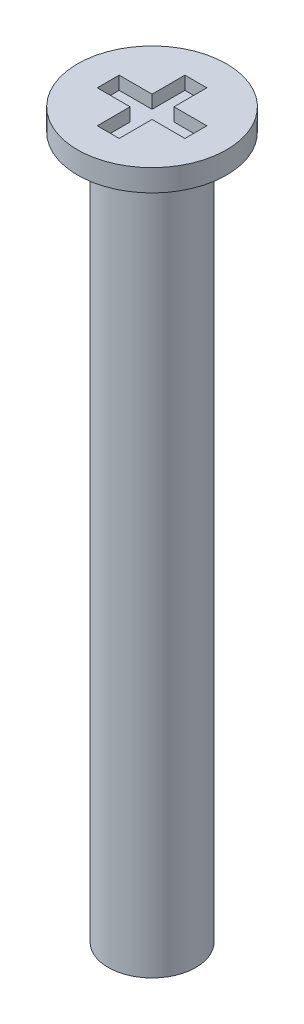
ISO-10303-21;
HEADER;
FILE_DESCRIPTION(('STEP AP214'),'2;1');
FILE_NAME('part.step','',(''),(''),'','','');
FILE_SCHEMA(('AUTOMOTIVE_DESIGN { 1 0 10303 214 1 1 1 1 }'));
ENDSEC;
DATA;
#1=APPLICATION_CONTEXT('core data for automotive mechanical design processes');
#2=APPLICATION_PROTOCOL_DEFINITION('international standard','automotive_design',2000,#1);
#3=PRODUCT_CONTEXT('',#1,'mechanical');
#4=PRODUCT('Part','Part','',(#3));
#5=PRODUCT_RELATED_PRODUCT_CATEGORY('part','',(#4));
#6=PRODUCT_DEFINITION_FORMATION('','',#4);
#7=PRODUCT_DEFINITION_CONTEXT('part definition',#1,'design');
#8=PRODUCT_DEFINITION('design','',#6,#7);
#9=PRODUCT_DEFINITION_SHAPE('','',#8);
#10=(LENGTH_UNIT() NAMED_UNIT(*) SI_UNIT(.MILLI.,.METRE.));
#11=(NAMED_UNIT(*) PLANE_ANGLE_UNIT() SI_UNIT($,.RADIAN.));
#12=(NAMED_UNIT(*) SI_UNIT($,.STERADIAN.) SOLID_ANGLE_UNIT());
#13=UNCERTAINTY_MEASURE_WITH_UNIT(LENGTH_MEASURE(1.E-05),#10,'distance_accuracy_value','');
#14=(GEOMETRIC_REPRESENTATION_CONTEXT(3) GLOBAL_UNCERTAINTY_ASSIGNED_CONTEXT((#13)) GLOBAL_UNIT_ASSIGNED_CONTEXT((#10,
#11,#12)) REPRESENTATION_CONTEXT('',''));
#15=CARTESIAN_POINT('',(0.,0.,0.));
#16=DIRECTION('',(0.,0.,1.));
#17=DIRECTION('',(1.,0.,0.));
#18=AXIS2_PLACEMENT_3D('',#15,#16,#17);
#19=CARTESIAN_POINT('',(0.,0.,0.));
#20=DIRECTION('',(0.,1.,0.));
#21=DIRECTION('',(0.,0.,1.));
#22=AXIS2_PLACEMENT_3D('',#19,#20,#21);
#23=PLANE('',#22);
#24=DIRECTION('',(-1.,0.,0.));
#25=VECTOR('',#24,1.);
#26=CARTESIAN_POINT('',(0.,0.,-0.25));
#27=LINE('',#26,#25);
#28=CARTESIAN_POINT('',(1.,0.,-0.249999999999997));
#29=VERTEX_POINT('',#28);
#30=CARTESIAN_POINT('',(0.25,0.,-0.249999999999999));
#31=VERTEX_POINT('',#30);
#32=EDGE_CURVE('E216',#29,#31,#27,.T.);
#33=ORIENTED_EDGE('',*,*,#32,.F.);
#34=DIRECTION('',(0.,0.,-1.));
#35=VECTOR('',#34,1.);
#36=CARTESIAN_POINT('',(1.,0.,-0.249999999999997));
#37=LINE('',#36,#35);
#38=CARTESIAN_POINT('',(0.999999999999999,0.,0.250000000000003));
#39=VERTEX_POINT('',#38);
#40=EDGE_CURVE('E143',#39,#29,#37,.T.);
#41=ORIENTED_EDGE('',*,*,#40,.F.);
#42=DIRECTION('',(1.,0.,0.));
#43=VECTOR('',#42,1.);
#44=CARTESIAN_POINT('',(0.,0.,0.25));
#45=LINE('',#44,#43);
#46=CARTESIAN_POINT('',(0.25,0.,0.250000000000003));
#47=VERTEX_POINT('',#46);
#48=EDGE_CURVE('E219',#47,#39,#45,.T.);
#49=ORIENTED_EDGE('',*,*,#48,.F.);
#50=DIRECTION('',(0.,0.,-1.));
#51=VECTOR('',#50,1.);
#52=CARTESIAN_POINT('',(0.25,0.,0.));
#53=LINE('',#52,#51);
#54=CARTESIAN_POINT('',(0.25,0.,1.));
#55=VERTEX_POINT('',#54);
#56=EDGE_CURVE('E176',#55,#47,#53,.T.);
#57=ORIENTED_EDGE('',*,*,#56,.F.);
#58=DIRECTION('',(1.,0.,0.));
#59=VECTOR('',#58,1.);
#60=CARTESIAN_POINT('',(0.25,0.,1.));
#61=LINE('',#60,#59);
#62=CARTESIAN_POINT('',(-0.25,0.,1.));
#63=VERTEX_POINT('',#62);
#64=EDGE_CURVE('E181',#63,#55,#61,.T.);
#65=ORIENTED_EDGE('',*,*,#64,.F.);
#66=DIRECTION('',(0.,0.,1.));
#67=VECTOR('',#66,1.);
#68=CARTESIAN_POINT('',(-0.25,0.,0.));
#69=LINE('',#68,#67);
#70=CARTESIAN_POINT('',(-0.25,0.,0.249999999999998));
#71=VERTEX_POINT('',#70);
#72=EDGE_CURVE('E192',#71,#63,#69,.T.);
#73=ORIENTED_EDGE('',*,*,#72,.F.);
#74=DIRECTION('',(1.,0.,0.));
#75=VECTOR('',#74,1.);
#76=CARTESIAN_POINT('',(0.,0.,0.25));
#77=LINE('',#76,#75);
#78=CARTESIAN_POINT('',(-1.,0.,0.24999999999999));
#79=VERTEX_POINT('',#78);
#80=EDGE_CURVE('E165',#79,#71,#77,.T.);
#81=ORIENTED_EDGE('',*,*,#80,.F.);
#82=DIRECTION('',(0.,0.,1.));
#83=VECTOR('',#82,1.);
#84=CARTESIAN_POINT('',(-1.,0.,0.24999999999999));
#85=LINE('',#84,#83);
#86=CARTESIAN_POINT('',(-0.999999999999997,0.,-0.25000000000001));
#87=VERTEX_POINT('',#86);
#88=EDGE_CURVE('E162',#87,#79,#85,.T.);
#89=ORIENTED_EDGE('',*,*,#88,.F.);
#90=CARTESIAN_POINT('',(-0.25,0.,-0.250000000000001));
#91=VERTEX_POINT('',#90);
#92=EDGE_CURVE('E149',#91,#87,#27,.T.);
#93=ORIENTED_EDGE('',*,*,#92,.F.);
#94=DIRECTION('',(0.,0.,1.));
#95=VECTOR('',#94,1.);
#96=CARTESIAN_POINT('',(-0.25,0.,0.));
#97=LINE('',#96,#95);
#98=CARTESIAN_POINT('',(-0.25,0.,-1.));
#99=VERTEX_POINT('',#98);
#100=EDGE_CURVE('E237',#99,#91,#97,.T.);
#101=ORIENTED_EDGE('',*,*,#100,.F.);
#102=DIRECTION('',(-1.,0.,0.));
#103=VECTOR('',#102,1.);
#104=CARTESIAN_POINT('',(-0.25,0.,-1.));
#105=LINE('',#104,#103);
#106=CARTESIAN_POINT('',(0.25,0.,-1.));
#107=VERTEX_POINT('',#106);
#108=EDGE_CURVE('E241',#107,#99,#105,.T.);
#109=ORIENTED_EDGE('',*,*,#108,.F.);
#110=DIRECTION('',(0.,0.,-1.));
#111=VECTOR('',#110,1.);
#112=CARTESIAN_POINT('',(0.25,0.,0.));
#113=LINE('',#112,#111);
#114=EDGE_CURVE('E68',#31,#107,#113,.T.);
#115=ORIENTED_EDGE('',*,*,#114,.F.);
#116=EDGE_LOOP('',(#33,#41,#49,#57,#65,#73,#81,#89,#93,#101,#109,#115));
#117=FACE_BOUND('',#116,.T.);
#118=CARTESIAN_POINT('',(0.,0.,0.));
#119=DIRECTION('',(0.,-1.,0.));
#120=DIRECTION('',(0.,0.,-1.));
#121=AXIS2_PLACEMENT_3D('',#118,#119,#120);
#122=CIRCLE('',#121,1.7);
#123=CARTESIAN_POINT('',(0.,0.,-1.7));
#124=VERTEX_POINT('',#123);
#125=EDGE_CURVE('E11',#124,#124,#122,.T.);
#126=ORIENTED_EDGE('',*,*,#125,.F.);
#127=EDGE_LOOP('',(#126));
#128=FACE_BOUND('',#127,.T.);
#129=ADVANCED_FACE('F39',(#117,#128),#23,.T.);
#130=CARTESIAN_POINT('',(0.,-16.5,0.));
#131=DIRECTION('',(0.,-1.,0.));
#132=DIRECTION('',(0.,0.,-1.));
#133=AXIS2_PLACEMENT_3D('',#130,#131,#132);
#134=CYLINDRICAL_SURFACE('',#133,1.7);
#135=ORIENTED_EDGE('',*,*,#125,.T.);
#136=EDGE_LOOP('',(#135));
#137=FACE_BOUND('',#136,.T.);
#138=CARTESIAN_POINT('',(0.,-0.5,0.));
#139=DIRECTION('',(0.,-1.,0.));
#140=DIRECTION('',(0.,0.,-1.));
#141=AXIS2_PLACEMENT_3D('',#138,#139,#140);
#142=CIRCLE('',#141,1.7);
#143=CARTESIAN_POINT('',(0.,-0.5,-1.7));
#144=VERTEX_POINT('',#143);
#145=EDGE_CURVE('E48',#144,#144,#142,.T.);
#146=ORIENTED_EDGE('',*,*,#145,.F.);
#147=EDGE_LOOP('',(#146));
#148=FACE_BOUND('',#147,.T.);
#149=ADVANCED_FACE('F273',(#137,#148),#134,.T.);
#150=CARTESIAN_POINT('',(1.7,-0.5,0.));
#151=DIRECTION('',(0.,-1.,0.));
#152=DIRECTION('',(0.,0.,-1.));
#153=AXIS2_PLACEMENT_3D('',#150,#151,#152);
#154=PLANE('',#153);
#155=ORIENTED_EDGE('',*,*,#145,.T.);
#156=EDGE_LOOP('',(#155));
#157=FACE_BOUND('',#156,.T.);
#158=CARTESIAN_POINT('',(0.,-0.5,0.));
#159=DIRECTION('',(0.,-1.,0.));
#160=DIRECTION('',(0.,0.,-1.));
#161=AXIS2_PLACEMENT_3D('',#158,#159,#160);
#162=CIRCLE('',#161,1.);
#163=CARTESIAN_POINT('',(0.,-0.5,-1.));
#164=VERTEX_POINT('',#163);
#165=EDGE_CURVE('E263',#164,#164,#162,.T.);
#166=ORIENTED_EDGE('',*,*,#165,.F.);
#167=EDGE_LOOP('',(#166));
#168=FACE_BOUND('',#167,.T.);
#169=ADVANCED_FACE('F270',(#157,#168),#154,.T.);
#170=CARTESIAN_POINT('',(0.,-16.5,0.));
#171=DIRECTION('',(0.,-1.,0.));
#172=DIRECTION('',(0.,0.,-1.));
#173=AXIS2_PLACEMENT_3D('',#170,#171,#172);
#174=CYLINDRICAL_SURFACE('',#173,1.);
#175=ORIENTED_EDGE('',*,*,#165,.T.);
#176=EDGE_LOOP('',(#175));
#177=FACE_BOUND('',#176,.T.);
#178=CARTESIAN_POINT('',(0.,-16.5,0.));
#179=DIRECTION('',(0.,-1.,0.));
#180=DIRECTION('',(0.,0.,-1.));
#181=AXIS2_PLACEMENT_3D('',#178,#179,#180);
#182=CIRCLE('',#181,1.);
#183=CARTESIAN_POINT('',(0.,-16.5,-1.));
#184=VERTEX_POINT('',#183);
#185=EDGE_CURVE('E257',#184,#184,#182,.T.);
#186=ORIENTED_EDGE('',*,*,#185,.F.);
#187=EDGE_LOOP('',(#186));
#188=FACE_BOUND('',#187,.T.);
#189=ADVANCED_FACE('F280',(#177,#188),#174,.T.);
#190=CARTESIAN_POINT('',(1.,-16.5,0.));
#191=DIRECTION('',(0.,-1.,0.));
#192=DIRECTION('',(0.,0.,-1.));
#193=AXIS2_PLACEMENT_3D('',#190,#191,#192);
#194=PLANE('',#193);
#195=ORIENTED_EDGE('',*,*,#185,.T.);
#196=EDGE_LOOP('',(#195));
#197=FACE_BOUND('',#196,.T.);
#198=ADVANCED_FACE('F286',(#197),#194,.T.);
#199=CARTESIAN_POINT('',(-0.25,-0.3,0.));
#200=DIRECTION('',(-1.,0.,0.));
#201=DIRECTION('',(0.,-1.,0.));
#202=AXIS2_PLACEMENT_3D('',#199,#200,#201);
#203=PLANE('',#202);
#204=ORIENTED_EDGE('',*,*,#100,.T.);
#205=DIRECTION('',(0.,-1.,0.));
#206=VECTOR('',#205,1.);
#207=CARTESIAN_POINT('',(-0.25,-0.3,-0.250000000000001));
#208=LINE('',#207,#206);
#209=CARTESIAN_POINT('',(-0.25,-0.3,-0.250000000000001));
#210=VERTEX_POINT('',#209);
#211=EDGE_CURVE('E234',#91,#210,#208,.T.);
#212=ORIENTED_EDGE('',*,*,#211,.T.);
#213=DIRECTION('',(0.,0.,1.));
#214=VECTOR('',#213,1.);
#215=CARTESIAN_POINT('',(-0.25,-0.3,0.));
#216=LINE('',#215,#214);
#217=CARTESIAN_POINT('',(-0.25,-0.3,-1.));
#218=VERTEX_POINT('',#217);
#219=EDGE_CURVE('E140',#218,#210,#216,.T.);
#220=ORIENTED_EDGE('',*,*,#219,.F.);
#221=DIRECTION('',(0.,1.,0.));
#222=VECTOR('',#221,1.);
#223=CARTESIAN_POINT('',(-0.25,-0.3,-1.));
#224=LINE('',#223,#222);
#225=EDGE_CURVE('E56',#218,#99,#224,.T.);
#226=ORIENTED_EDGE('',*,*,#225,.T.);
#227=EDGE_LOOP('',(#204,#212,#220,#226));
#228=FACE_BOUND('',#227,.T.);
#229=ADVANCED_FACE('F290',(#228),#203,.F.);
#230=CARTESIAN_POINT('',(-0.25,-0.3,-1.));
#231=DIRECTION('',(0.,0.,-1.));
#232=DIRECTION('',(-1.,0.,0.));
#233=AXIS2_PLACEMENT_3D('',#230,#231,#232);
#234=PLANE('',#233);
#235=ORIENTED_EDGE('',*,*,#108,.T.);
#236=ORIENTED_EDGE('',*,*,#225,.F.);
#237=DIRECTION('',(-1.,0.,0.));
#238=VECTOR('',#237,1.);
#239=CARTESIAN_POINT('',(-0.25,-0.3,-1.));
#240=LINE('',#239,#238);
#241=CARTESIAN_POINT('',(0.25,-0.3,-1.));
#242=VERTEX_POINT('',#241);
#243=EDGE_CURVE('E244',#242,#218,#240,.T.);
#244=ORIENTED_EDGE('',*,*,#243,.F.);
#245=DIRECTION('',(0.,1.,0.));
#246=VECTOR('',#245,1.);
#247=CARTESIAN_POINT('',(0.25,-0.3,-1.));
#248=LINE('',#247,#246);
#249=EDGE_CURVE('E247',#242,#107,#248,.T.);
#250=ORIENTED_EDGE('',*,*,#249,.T.);
#251=EDGE_LOOP('',(#235,#236,#244,#250));
#252=FACE_BOUND('',#251,.T.);
#253=ADVANCED_FACE('F294',(#252),#234,.F.);
#254=CARTESIAN_POINT('',(0.25,-0.3,0.));
#255=DIRECTION('',(1.,0.,0.));
#256=DIRECTION('',(0.,1.,0.));
#257=AXIS2_PLACEMENT_3D('',#254,#255,#256);
#258=PLANE('',#257);
#259=DIRECTION('',(0.,0.,-1.));
#260=VECTOR('',#259,1.);
#261=CARTESIAN_POINT('',(0.25,-0.3,0.));
#262=LINE('',#261,#260);
#263=CARTESIAN_POINT('',(0.25,-0.3,-0.249999999999999));
#264=VERTEX_POINT('',#263);
#265=EDGE_CURVE('E240',#264,#242,#262,.T.);
#266=ORIENTED_EDGE('',*,*,#265,.F.);
#267=DIRECTION('',(0.,1.,0.));
#268=VECTOR('',#267,1.);
#269=CARTESIAN_POINT('',(0.25,-0.3,-0.249999999999999));
#270=LINE('',#269,#268);
#271=EDGE_CURVE('E228',#264,#31,#270,.T.);
#272=ORIENTED_EDGE('',*,*,#271,.T.);
#273=ORIENTED_EDGE('',*,*,#114,.T.);
#274=ORIENTED_EDGE('',*,*,#249,.F.);
#275=EDGE_LOOP('',(#266,#272,#273,#274));
#276=FACE_BOUND('',#275,.T.);
#277=ADVANCED_FACE('F296',(#276),#258,.F.);
#278=CARTESIAN_POINT('',(0.,-0.3,0.));
#279=DIRECTION('',(0.,-1.,0.));
#280=DIRECTION('',(1.,0.,0.));
#281=AXIS2_PLACEMENT_3D('',#278,#279,#280);
#282=PLANE('',#281);
#283=DIRECTION('',(-1.,0.,0.));
#284=VECTOR('',#283,1.);
#285=CARTESIAN_POINT('',(0.,-0.3,-0.25));
#286=LINE('',#285,#284);
#287=CARTESIAN_POINT('',(1.,-0.3,-0.249999999999997));
#288=VERTEX_POINT('',#287);
#289=EDGE_CURVE('E142',#288,#264,#286,.T.);
#290=ORIENTED_EDGE('',*,*,#289,.T.);
#291=ORIENTED_EDGE('',*,*,#265,.T.);
#292=ORIENTED_EDGE('',*,*,#243,.T.);
#293=ORIENTED_EDGE('',*,*,#219,.T.);
#294=CARTESIAN_POINT('',(-0.999999999999997,-0.3,-0.25000000000001));
#295=VERTEX_POINT('',#294);
#296=EDGE_CURVE('E76',#210,#295,#286,.T.);
#297=ORIENTED_EDGE('',*,*,#296,.T.);
#298=DIRECTION('',(0.,0.,1.));
#299=VECTOR('',#298,1.);
#300=CARTESIAN_POINT('',(-1.,-0.3,0.24999999999999));
#301=LINE('',#300,#299);
#302=CARTESIAN_POINT('',(-1.,-0.3,0.24999999999999));
#303=VERTEX_POINT('',#302);
#304=EDGE_CURVE('E138',#295,#303,#301,.T.);
#305=ORIENTED_EDGE('',*,*,#304,.T.);
#306=DIRECTION('',(1.,0.,0.));
#307=VECTOR('',#306,1.);
#308=CARTESIAN_POINT('',(0.,-0.3,0.25));
#309=LINE('',#308,#307);
#310=CARTESIAN_POINT('',(-0.25,-0.3,0.249999999999998));
#311=VERTEX_POINT('',#310);
#312=EDGE_CURVE('E159',#303,#311,#309,.T.);
#313=ORIENTED_EDGE('',*,*,#312,.T.);
#314=DIRECTION('',(0.,0.,1.));
#315=VECTOR('',#314,1.);
#316=CARTESIAN_POINT('',(-0.25,-0.3,0.));
#317=LINE('',#316,#315);
#318=CARTESIAN_POINT('',(-0.25,-0.3,1.));
#319=VERTEX_POINT('',#318);
#320=EDGE_CURVE('E180',#311,#319,#317,.T.);
#321=ORIENTED_EDGE('',*,*,#320,.T.);
#322=DIRECTION('',(1.,0.,0.));
#323=VECTOR('',#322,1.);
#324=CARTESIAN_POINT('',(0.25,-0.3,1.));
#325=LINE('',#324,#323);
#326=CARTESIAN_POINT('',(0.25,-0.3,1.));
#327=VERTEX_POINT('',#326);
#328=EDGE_CURVE('E184',#319,#327,#325,.T.);
#329=ORIENTED_EDGE('',*,*,#328,.T.);
#330=DIRECTION('',(0.,0.,-1.));
#331=VECTOR('',#330,1.);
#332=CARTESIAN_POINT('',(0.25,-0.3,0.));
#333=LINE('',#332,#331);
#334=CARTESIAN_POINT('',(0.25,-0.3,0.250000000000003));
#335=VERTEX_POINT('',#334);
#336=EDGE_CURVE('E177',#327,#335,#333,.T.);
#337=ORIENTED_EDGE('',*,*,#336,.T.);
#338=DIRECTION('',(1.,0.,0.));
#339=VECTOR('',#338,1.);
#340=CARTESIAN_POINT('',(0.,-0.3,0.25));
#341=LINE('',#340,#339);
#342=CARTESIAN_POINT('',(0.999999999999999,-0.3,0.250000000000003));
#343=VERTEX_POINT('',#342);
#344=EDGE_CURVE('E208',#335,#343,#341,.T.);
#345=ORIENTED_EDGE('',*,*,#344,.T.);
#346=DIRECTION('',(0.,0.,-1.));
#347=VECTOR('',#346,1.);
#348=CARTESIAN_POINT('',(1.,-0.3,-0.249999999999997));
#349=LINE('',#348,#347);
#350=EDGE_CURVE('E211',#343,#288,#349,.T.);
#351=ORIENTED_EDGE('',*,*,#350,.T.);
#352=EDGE_LOOP('',(#290,#291,#292,#293,#297,#305,#313,#321,#329,#337,#345,#351));
#353=FACE_BOUND('',#352,.T.);
#354=ADVANCED_FACE('F136',(#353),#282,.F.);
#355=CARTESIAN_POINT('',(0.,-0.3,-0.25));
#356=DIRECTION('',(0.,0.,-1.));
#357=DIRECTION('',(-1.,0.,0.));
#358=AXIS2_PLACEMENT_3D('',#355,#356,#357);
#359=PLANE('',#358);
#360=ORIENTED_EDGE('',*,*,#92,.T.);
#361=DIRECTION('',(0.,1.,0.));
#362=VECTOR('',#361,1.);
#363=CARTESIAN_POINT('',(-0.999999999999997,-0.3,-0.25000000000001));
#364=LINE('',#363,#362);
#365=EDGE_CURVE('E146',#295,#87,#364,.T.);
#366=ORIENTED_EDGE('',*,*,#365,.F.);
#367=ORIENTED_EDGE('',*,*,#296,.F.);
#368=ORIENTED_EDGE('',*,*,#211,.F.);
#369=EDGE_LOOP('',(#360,#366,#367,#368));
#370=FACE_BOUND('',#369,.T.);
#371=ADVANCED_FACE('F147',(#370),#359,.F.);
#372=ORIENTED_EDGE('',*,*,#289,.F.);
#373=DIRECTION('',(0.,1.,0.));
#374=VECTOR('',#373,1.);
#375=CARTESIAN_POINT('',(1.,-0.3,-0.249999999999997));
#376=LINE('',#375,#374);
#377=EDGE_CURVE('E225',#288,#29,#376,.T.);
#378=ORIENTED_EDGE('',*,*,#377,.T.);
#379=ORIENTED_EDGE('',*,*,#32,.T.);
#380=ORIENTED_EDGE('',*,*,#271,.F.);
#381=EDGE_LOOP('',(#372,#378,#379,#380));
#382=FACE_BOUND('',#381,.T.);
#383=ADVANCED_FACE('F305',(#382),#359,.F.);
#384=CARTESIAN_POINT('',(1.,-0.3,-0.249999999999997));
#385=DIRECTION('',(1.,0.,0.));
#386=DIRECTION('',(0.,0.,-1.));
#387=AXIS2_PLACEMENT_3D('',#384,#385,#386);
#388=PLANE('',#387);
#389=ORIENTED_EDGE('',*,*,#40,.T.);
#390=ORIENTED_EDGE('',*,*,#377,.F.);
#391=ORIENTED_EDGE('',*,*,#350,.F.);
#392=DIRECTION('',(0.,1.,0.));
#393=VECTOR('',#392,1.);
#394=CARTESIAN_POINT('',(0.999999999999999,-0.3,0.250000000000003));
#395=LINE('',#394,#393);
#396=EDGE_CURVE('E215',#343,#39,#395,.T.);
#397=ORIENTED_EDGE('',*,*,#396,.T.);
#398=EDGE_LOOP('',(#389,#390,#391,#397));
#399=FACE_BOUND('',#398,.T.);
#400=ADVANCED_FACE('F310',(#399),#388,.F.);
#401=CARTESIAN_POINT('',(0.,-0.3,0.25));
#402=DIRECTION('',(0.,0.,1.));
#403=DIRECTION('',(1.,0.,0.));
#404=AXIS2_PLACEMENT_3D('',#401,#402,#403);
#405=PLANE('',#404);
#406=DIRECTION('',(0.,1.,0.));
#407=VECTOR('',#406,1.);
#408=CARTESIAN_POINT('',(0.25,-0.3,0.250000000000001));
#409=LINE('',#408,#407);
#410=EDGE_CURVE('E201',#335,#47,#409,.T.);
#411=ORIENTED_EDGE('',*,*,#410,.T.);
#412=ORIENTED_EDGE('',*,*,#48,.T.);
#413=ORIENTED_EDGE('',*,*,#396,.F.);
#414=ORIENTED_EDGE('',*,*,#344,.F.);
#415=EDGE_LOOP('',(#411,#412,#413,#414));
#416=FACE_BOUND('',#415,.T.);
#417=ADVANCED_FACE('F306',(#416),#405,.F.);
#418=CARTESIAN_POINT('',(0.25,-0.3,0.));
#419=DIRECTION('',(1.,0.,0.));
#420=DIRECTION('',(0.,1.,0.));
#421=AXIS2_PLACEMENT_3D('',#418,#419,#420);
#422=PLANE('',#421);
#423=ORIENTED_EDGE('',*,*,#336,.F.);
#424=DIRECTION('',(0.,1.,0.));
#425=VECTOR('',#424,1.);
#426=CARTESIAN_POINT('',(0.25,-0.3,1.));
#427=LINE('',#426,#425);
#428=EDGE_CURVE('E198',#327,#55,#427,.T.);
#429=ORIENTED_EDGE('',*,*,#428,.T.);
#430=ORIENTED_EDGE('',*,*,#56,.T.);
#431=ORIENTED_EDGE('',*,*,#410,.F.);
#432=EDGE_LOOP('',(#423,#429,#430,#431));
#433=FACE_BOUND('',#432,.T.);
#434=ADVANCED_FACE('F309',(#433),#422,.F.);
#435=CARTESIAN_POINT('',(0.25,-0.3,1.));
#436=DIRECTION('',(0.,0.,1.));
#437=DIRECTION('',(1.,0.,0.));
#438=AXIS2_PLACEMENT_3D('',#435,#436,#437);
#439=PLANE('',#438);
#440=ORIENTED_EDGE('',*,*,#64,.T.);
#441=ORIENTED_EDGE('',*,*,#428,.F.);
#442=ORIENTED_EDGE('',*,*,#328,.F.);
#443=DIRECTION('',(0.,1.,0.));
#444=VECTOR('',#443,1.);
#445=CARTESIAN_POINT('',(-0.25,-0.3,1.));
#446=LINE('',#445,#444);
#447=EDGE_CURVE('E188',#319,#63,#446,.T.);
#448=ORIENTED_EDGE('',*,*,#447,.T.);
#449=EDGE_LOOP('',(#440,#441,#442,#448));
#450=FACE_BOUND('',#449,.T.);
#451=ADVANCED_FACE('F317',(#450),#439,.F.);
#452=CARTESIAN_POINT('',(-0.25,-0.3,0.));
#453=DIRECTION('',(-1.,0.,0.));
#454=DIRECTION('',(0.,-1.,0.));
#455=AXIS2_PLACEMENT_3D('',#452,#453,#454);
#456=PLANE('',#455);
#457=DIRECTION('',(0.,1.,0.));
#458=VECTOR('',#457,1.);
#459=CARTESIAN_POINT('',(-0.25,-0.3,0.249999999999998));
#460=LINE('',#459,#458);
#461=EDGE_CURVE('E172',#311,#71,#460,.T.);
#462=ORIENTED_EDGE('',*,*,#461,.T.);
#463=ORIENTED_EDGE('',*,*,#72,.T.);
#464=ORIENTED_EDGE('',*,*,#447,.F.);
#465=ORIENTED_EDGE('',*,*,#320,.F.);
#466=EDGE_LOOP('',(#462,#463,#464,#465));
#467=FACE_BOUND('',#466,.T.);
#468=ADVANCED_FACE('F319',(#467),#456,.F.);
#469=CARTESIAN_POINT('',(0.,-0.3,0.25));
#470=DIRECTION('',(0.,0.,1.));
#471=DIRECTION('',(1.,0.,0.));
#472=AXIS2_PLACEMENT_3D('',#469,#470,#471);
#473=PLANE('',#472);
#474=ORIENTED_EDGE('',*,*,#312,.F.);
#475=DIRECTION('',(0.,1.,0.));
#476=VECTOR('',#475,1.);
#477=CARTESIAN_POINT('',(-1.,-0.3,0.24999999999999));
#478=LINE('',#477,#476);
#479=EDGE_CURVE('E154',#303,#79,#478,.T.);
#480=ORIENTED_EDGE('',*,*,#479,.T.);
#481=ORIENTED_EDGE('',*,*,#80,.T.);
#482=ORIENTED_EDGE('',*,*,#461,.F.);
#483=EDGE_LOOP('',(#474,#480,#481,#482));
#484=FACE_BOUND('',#483,.T.);
#485=ADVANCED_FACE('F322',(#484),#473,.F.);
#486=CARTESIAN_POINT('',(-1.,-0.3,0.24999999999999));
#487=DIRECTION('',(-1.,0.,0.));
#488=DIRECTION('',(0.,0.,1.));
#489=AXIS2_PLACEMENT_3D('',#486,#487,#488);
#490=PLANE('',#489);
#491=ORIENTED_EDGE('',*,*,#88,.T.);
#492=ORIENTED_EDGE('',*,*,#479,.F.);
#493=ORIENTED_EDGE('',*,*,#304,.F.);
#494=ORIENTED_EDGE('',*,*,#365,.T.);
#495=EDGE_LOOP('',(#491,#492,#493,#494));
#496=FACE_BOUND('',#495,.T.);
#497=ADVANCED_FACE('F156',(#496),#490,.F.);
#498=CLOSED_SHELL('',(#129,#149,#169,#189,#198,#229,#253,#277,#354,#371,#383,#400,#417,#434,
#451,#468,#485,#497));
#499=MANIFOLD_SOLID_BREP('B2',#498);
#500=ADVANCED_BREP_SHAPE_REPRESENTATION('',(#18,#499),#14);
#501=SHAPE_DEFINITION_REPRESENTATION(#9,#500);
ENDSEC;
END-ISO-10303-21;
